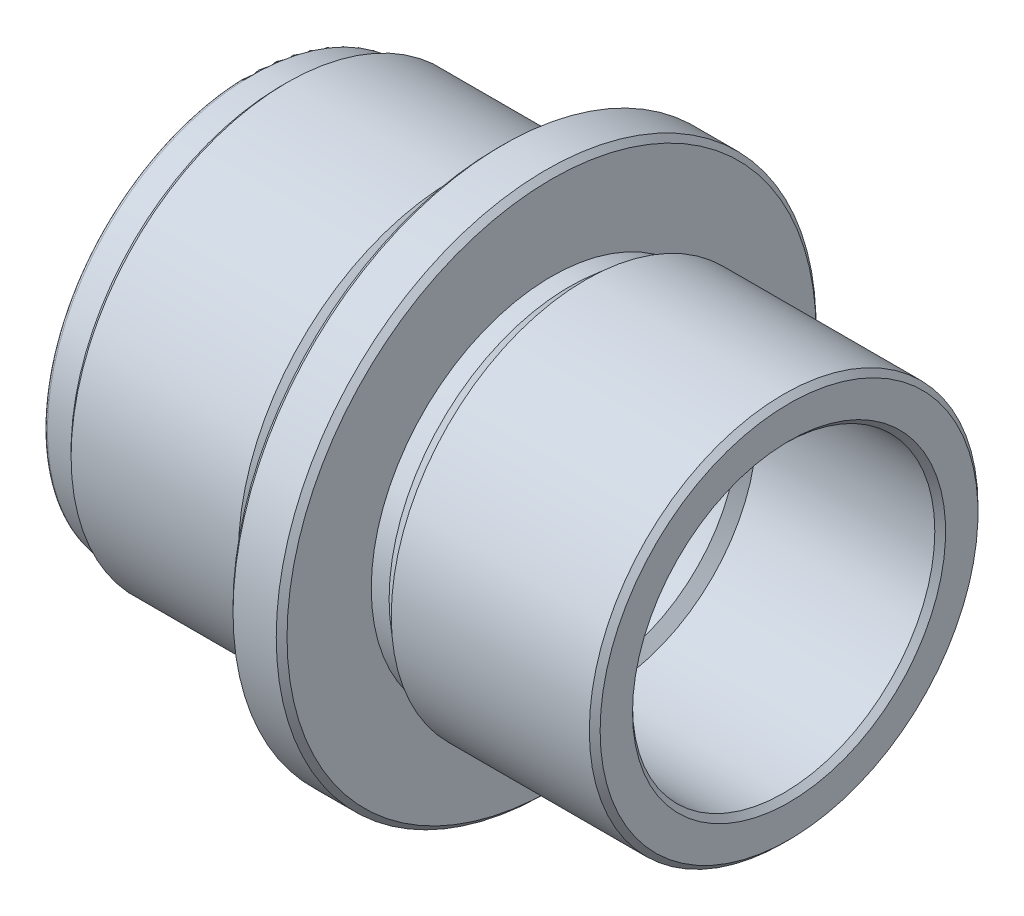
ISO-10303-21;
HEADER;
FILE_DESCRIPTION(('STEP AP214'),'2;1');
FILE_NAME('part.step','',(''),(''),'','','');
FILE_SCHEMA(('AUTOMOTIVE_DESIGN { 1 0 10303 214 1 1 1 1 }'));
ENDSEC;
DATA;
#1=APPLICATION_CONTEXT('core data for automotive mechanical design processes');
#2=APPLICATION_PROTOCOL_DEFINITION('international standard','automotive_design',2000,#1);
#3=PRODUCT_CONTEXT('',#1,'mechanical');
#4=PRODUCT('Part','Part','',(#3));
#5=PRODUCT_RELATED_PRODUCT_CATEGORY('part','',(#4));
#6=PRODUCT_DEFINITION_FORMATION('','',#4);
#7=PRODUCT_DEFINITION_CONTEXT('part definition',#1,'design');
#8=PRODUCT_DEFINITION('design','',#6,#7);
#9=PRODUCT_DEFINITION_SHAPE('','',#8);
#10=(LENGTH_UNIT() NAMED_UNIT(*) SI_UNIT(.MILLI.,.METRE.));
#11=(NAMED_UNIT(*) PLANE_ANGLE_UNIT() SI_UNIT($,.RADIAN.));
#12=(NAMED_UNIT(*) SI_UNIT($,.STERADIAN.) SOLID_ANGLE_UNIT());
#13=UNCERTAINTY_MEASURE_WITH_UNIT(LENGTH_MEASURE(1.E-05),#10,'distance_accuracy_value','');
#14=(GEOMETRIC_REPRESENTATION_CONTEXT(3) GLOBAL_UNCERTAINTY_ASSIGNED_CONTEXT((#13)) GLOBAL_UNIT_ASSIGNED_CONTEXT((#10,
#11,#12)) REPRESENTATION_CONTEXT('',''));
#15=CARTESIAN_POINT('',(0.,0.,0.));
#16=DIRECTION('',(0.,0.,1.));
#17=DIRECTION('',(1.,0.,0.));
#18=AXIS2_PLACEMENT_3D('',#15,#16,#17);
#19=CARTESIAN_POINT('',(0.,0.,0.));
#20=DIRECTION('',(-1.,0.,0.));
#21=DIRECTION('',(0.,0.,1.));
#22=AXIS2_PLACEMENT_3D('',#19,#20,#21);
#23=CYLINDRICAL_SURFACE('',#22,35.5600000000001);
#24=CARTESIAN_POINT('',(1.27000000000002,0.,0.));
#25=DIRECTION('',(1.,0.,0.));
#26=DIRECTION('',(0.,0.,-1.));
#27=AXIS2_PLACEMENT_3D('',#24,#25,#26);
#28=CIRCLE('',#27,35.5600000000001);
#29=CARTESIAN_POINT('',(1.27000000000002,0.,-35.5600000000001));
#30=VERTEX_POINT('',#29);
#31=EDGE_CURVE('E56',#30,#30,#28,.F.);
#32=ORIENTED_EDGE('',*,*,#31,.T.);
#33=EDGE_LOOP('',(#32));
#34=FACE_BOUND('',#33,.T.);
#35=CARTESIAN_POINT('',(10.16,0.,0.));
#36=DIRECTION('',(-1.,0.,0.));
#37=DIRECTION('',(0.,0.,1.));
#38=AXIS2_PLACEMENT_3D('',#35,#36,#37);
#39=CIRCLE('',#38,35.5600000000001);
#40=CARTESIAN_POINT('',(10.16,0.,35.5600000000001));
#41=VERTEX_POINT('',#40);
#42=EDGE_CURVE('E128',#41,#41,#39,.T.);
#43=ORIENTED_EDGE('',*,*,#42,.F.);
#44=EDGE_LOOP('',(#43));
#45=FACE_BOUND('',#44,.T.);
#46=ADVANCED_FACE('F34',(#34,#45),#23,.F.);
#47=CARTESIAN_POINT('',(0.,35.5600000000001,0.));
#48=DIRECTION('',(1.,0.,0.));
#49=DIRECTION('',(0.,0.,-1.));
#50=AXIS2_PLACEMENT_3D('',#47,#48,#49);
#51=PLANE('',#50);
#52=CARTESIAN_POINT('',(0.,0.,0.));
#53=DIRECTION('',(1.,0.,0.));
#54=DIRECTION('',(0.,0.,-1.));
#55=AXIS2_PLACEMENT_3D('',#52,#53,#54);
#56=CIRCLE('',#55,47.498);
#57=CARTESIAN_POINT('',(0.,0.,-47.498));
#58=VERTEX_POINT('',#57);
#59=EDGE_CURVE('E40',#58,#58,#56,.F.);
#60=ORIENTED_EDGE('',*,*,#59,.T.);
#61=EDGE_LOOP('',(#60));
#62=FACE_BOUND('',#61,.T.);
#63=CARTESIAN_POINT('',(0.,0.,0.));
#64=DIRECTION('',(1.,0.,0.));
#65=DIRECTION('',(0.,0.,-1.));
#66=AXIS2_PLACEMENT_3D('',#63,#64,#65);
#67=CIRCLE('',#66,36.8300000000001);
#68=CARTESIAN_POINT('',(0.,0.,-36.8300000000001));
#69=VERTEX_POINT('',#68);
#70=EDGE_CURVE('E53',#69,#69,#67,.T.);
#71=ORIENTED_EDGE('',*,*,#70,.T.);
#72=EDGE_LOOP('',(#71));
#73=FACE_BOUND('',#72,.T.);
#74=ADVANCED_FACE('F135',(#62,#73),#51,.F.);
#75=CARTESIAN_POINT('',(0.,0.,0.));
#76=DIRECTION('',(-1.,0.,0.));
#77=DIRECTION('',(0.,0.,1.));
#78=AXIS2_PLACEMENT_3D('',#75,#76,#77);
#79=CYLINDRICAL_SURFACE('',#78,48.26);
#80=CARTESIAN_POINT('',(0.762,0.,0.));
#81=DIRECTION('',(1.,0.,0.));
#82=DIRECTION('',(0.,0.,-1.));
#83=AXIS2_PLACEMENT_3D('',#80,#81,#82);
#84=CIRCLE('',#83,48.26);
#85=CARTESIAN_POINT('',(0.762,0.,-48.26));
#86=VERTEX_POINT('',#85);
#87=EDGE_CURVE('E10',#86,#86,#84,.T.);
#88=ORIENTED_EDGE('',*,*,#87,.T.);
#89=EDGE_LOOP('',(#88));
#90=FACE_BOUND('',#89,.T.);
#91=CARTESIAN_POINT('',(7.62,0.,0.));
#92=DIRECTION('',(-1.,0.,0.));
#93=DIRECTION('',(0.,0.,1.));
#94=AXIS2_PLACEMENT_3D('',#91,#92,#93);
#95=CIRCLE('',#94,48.26);
#96=CARTESIAN_POINT('',(7.62,0.,48.26));
#97=VERTEX_POINT('',#96);
#98=EDGE_CURVE('E89',#97,#97,#95,.T.);
#99=ORIENTED_EDGE('',*,*,#98,.T.);
#100=EDGE_LOOP('',(#99));
#101=FACE_BOUND('',#100,.T.);
#102=ADVANCED_FACE('F140',(#90,#101),#79,.T.);
#103=CARTESIAN_POINT('',(7.62,48.26,0.));
#104=DIRECTION('',(1.,0.,0.));
#105=DIRECTION('',(0.,0.,-1.));
#106=AXIS2_PLACEMENT_3D('',#103,#104,#105);
#107=PLANE('',#106);
#108=CARTESIAN_POINT('',(7.62,0.,0.));
#109=DIRECTION('',(1.,0.,0.));
#110=DIRECTION('',(0.,0.,-1.));
#111=AXIS2_PLACEMENT_3D('',#108,#109,#110);
#112=CIRCLE('',#111,49.53);
#113=CARTESIAN_POINT('',(7.62,0.,-49.53));
#114=VERTEX_POINT('',#113);
#115=EDGE_CURVE('E86',#114,#114,#112,.F.);
#116=ORIENTED_EDGE('',*,*,#115,.T.);
#117=EDGE_LOOP('',(#116));
#118=FACE_BOUND('',#117,.T.);
#119=ORIENTED_EDGE('',*,*,#98,.F.);
#120=EDGE_LOOP('',(#119));
#121=FACE_BOUND('',#120,.T.);
#122=ADVANCED_FACE('F247',(#118,#121),#107,.F.);
#123=CARTESIAN_POINT('',(0.,0.,0.));
#124=DIRECTION('',(-1.,0.,0.));
#125=DIRECTION('',(0.,0.,1.));
#126=AXIS2_PLACEMENT_3D('',#123,#124,#125);
#127=CYLINDRICAL_SURFACE('',#126,50.8);
#128=CARTESIAN_POINT('',(8.89000000000001,0.,0.));
#129=DIRECTION('',(1.,0.,0.));
#130=DIRECTION('',(0.,0.,-1.));
#131=AXIS2_PLACEMENT_3D('',#128,#129,#130);
#132=CIRCLE('',#131,50.8);
#133=CARTESIAN_POINT('',(8.89000000000001,0.,-50.8));
#134=VERTEX_POINT('',#133);
#135=EDGE_CURVE('E83',#134,#134,#132,.T.);
#136=ORIENTED_EDGE('',*,*,#135,.T.);
#137=EDGE_LOOP('',(#136));
#138=FACE_BOUND('',#137,.T.);
#139=CARTESIAN_POINT('',(48.26,0.,0.));
#140=DIRECTION('',(-1.,0.,0.));
#141=DIRECTION('',(0.,0.,1.));
#142=AXIS2_PLACEMENT_3D('',#139,#140,#141);
#143=CIRCLE('',#142,50.8);
#144=CARTESIAN_POINT('',(48.26,0.,50.8));
#145=VERTEX_POINT('',#144);
#146=EDGE_CURVE('E92',#145,#145,#143,.T.);
#147=ORIENTED_EDGE('',*,*,#146,.T.);
#148=EDGE_LOOP('',(#147));
#149=FACE_BOUND('',#148,.T.);
#150=ADVANCED_FACE('F243',(#138,#149),#127,.T.);
#151=CARTESIAN_POINT('',(50.8,0.,0.));
#152=DIRECTION('',(-1.,0.,0.));
#153=DIRECTION('',(0.,0.,1.));
#154=AXIS2_PLACEMENT_3D('',#151,#152,#153);
#155=CONICAL_SURFACE('',#154,48.26,0.785398163397448);
#156=ORIENTED_EDGE('',*,*,#146,.F.);
#157=EDGE_LOOP('',(#156));
#158=FACE_BOUND('',#157,.T.);
#159=CARTESIAN_POINT('',(50.8,0.,0.));
#160=DIRECTION('',(-1.,0.,0.));
#161=DIRECTION('',(0.,0.,1.));
#162=AXIS2_PLACEMENT_3D('',#159,#160,#161);
#163=CIRCLE('',#162,48.26);
#164=CARTESIAN_POINT('',(50.8,0.,48.26));
#165=VERTEX_POINT('',#164);
#166=EDGE_CURVE('E95',#165,#165,#163,.T.);
#167=ORIENTED_EDGE('',*,*,#166,.T.);
#168=EDGE_LOOP('',(#167));
#169=FACE_BOUND('',#168,.T.);
#170=ADVANCED_FACE('F239',(#158,#169),#155,.T.);
#171=CARTESIAN_POINT('',(0.,0.,0.));
#172=DIRECTION('',(-1.,0.,0.));
#173=DIRECTION('',(0.,0.,1.));
#174=AXIS2_PLACEMENT_3D('',#171,#172,#173);
#175=CYLINDRICAL_SURFACE('',#174,48.26);
#176=ORIENTED_EDGE('',*,*,#166,.F.);
#177=EDGE_LOOP('',(#176));
#178=FACE_BOUND('',#177,.T.);
#179=CARTESIAN_POINT('',(58.42,0.,0.));
#180=DIRECTION('',(-1.,0.,0.));
#181=DIRECTION('',(0.,0.,1.));
#182=AXIS2_PLACEMENT_3D('',#179,#180,#181);
#183=CIRCLE('',#182,48.26);
#184=CARTESIAN_POINT('',(58.42,0.,48.26));
#185=VERTEX_POINT('',#184);
#186=EDGE_CURVE('E98',#185,#185,#183,.T.);
#187=ORIENTED_EDGE('',*,*,#186,.T.);
#188=EDGE_LOOP('',(#187));
#189=FACE_BOUND('',#188,.T.);
#190=ADVANCED_FACE('F235',(#178,#189),#175,.T.);
#191=CARTESIAN_POINT('',(58.42,48.26,0.));
#192=DIRECTION('',(1.,0.,0.));
#193=DIRECTION('',(0.,0.,-1.));
#194=AXIS2_PLACEMENT_3D('',#191,#192,#193);
#195=PLANE('',#194);
#196=CARTESIAN_POINT('',(58.42,0.,0.));
#197=DIRECTION('',(1.,0.,0.));
#198=DIRECTION('',(0.,0.,-1.));
#199=AXIS2_PLACEMENT_3D('',#196,#197,#198);
#200=CIRCLE('',#199,62.23);
#201=CARTESIAN_POINT('',(58.42,0.,-62.23));
#202=VERTEX_POINT('',#201);
#203=EDGE_CURVE('E80',#202,#202,#200,.F.);
#204=ORIENTED_EDGE('',*,*,#203,.T.);
#205=EDGE_LOOP('',(#204));
#206=FACE_BOUND('',#205,.T.);
#207=ORIENTED_EDGE('',*,*,#186,.F.);
#208=EDGE_LOOP('',(#207));
#209=FACE_BOUND('',#208,.T.);
#210=ADVANCED_FACE('F231',(#206,#209),#195,.F.);
#211=CARTESIAN_POINT('',(0.,0.,0.));
#212=DIRECTION('',(-1.,0.,0.));
#213=DIRECTION('',(0.,0.,1.));
#214=AXIS2_PLACEMENT_3D('',#211,#212,#213);
#215=CYLINDRICAL_SURFACE('',#214,63.5);
#216=CARTESIAN_POINT('',(59.69,0.,0.));
#217=DIRECTION('',(1.,0.,0.));
#218=DIRECTION('',(0.,0.,-1.));
#219=AXIS2_PLACEMENT_3D('',#216,#217,#218);
#220=CIRCLE('',#219,63.5);
#221=CARTESIAN_POINT('',(59.69,0.,-63.5));
#222=VERTEX_POINT('',#221);
#223=EDGE_CURVE('E74',#222,#222,#220,.T.);
#224=ORIENTED_EDGE('',*,*,#223,.T.);
#225=EDGE_LOOP('',(#224));
#226=FACE_BOUND('',#225,.T.);
#227=CARTESIAN_POINT('',(69.8499999999998,0.,0.));
#228=DIRECTION('',(-1.,0.,0.));
#229=DIRECTION('',(0.,0.,1.));
#230=AXIS2_PLACEMENT_3D('',#227,#228,#229);
#231=CIRCLE('',#230,63.5);
#232=CARTESIAN_POINT('',(69.8499999999998,0.,63.5));
#233=VERTEX_POINT('',#232);
#234=EDGE_CURVE('E77',#233,#233,#231,.T.);
#235=ORIENTED_EDGE('',*,*,#234,.T.);
#236=EDGE_LOOP('',(#235));
#237=FACE_BOUND('',#236,.T.);
#238=ADVANCED_FACE('F227',(#226,#237),#215,.T.);
#239=CARTESIAN_POINT('',(71.1199999999999,63.5,0.));
#240=DIRECTION('',(-1.,0.,0.));
#241=DIRECTION('',(0.,0.,1.));
#242=AXIS2_PLACEMENT_3D('',#239,#240,#241);
#243=PLANE('',#242);
#244=CARTESIAN_POINT('',(71.1199999999999,0.,0.));
#245=DIRECTION('',(-1.,0.,0.));
#246=DIRECTION('',(0.,0.,1.));
#247=AXIS2_PLACEMENT_3D('',#244,#245,#246);
#248=CIRCLE('',#247,62.23);
#249=CARTESIAN_POINT('',(71.1199999999999,0.,62.23));
#250=VERTEX_POINT('',#249);
#251=EDGE_CURVE('E71',#250,#250,#248,.F.);
#252=ORIENTED_EDGE('',*,*,#251,.T.);
#253=EDGE_LOOP('',(#252));
#254=FACE_BOUND('',#253,.T.);
#255=CARTESIAN_POINT('',(71.1199999999999,0.,0.));
#256=DIRECTION('',(-1.,0.,0.));
#257=DIRECTION('',(0.,0.,1.));
#258=AXIS2_PLACEMENT_3D('',#255,#256,#257);
#259=CIRCLE('',#258,42.4161080074488);
#260=CARTESIAN_POINT('',(71.1199999999999,0.,42.4161080074488));
#261=VERTEX_POINT('',#260);
#262=EDGE_CURVE('E101',#261,#261,#259,.T.);
#263=ORIENTED_EDGE('',*,*,#262,.T.);
#264=EDGE_LOOP('',(#263));
#265=FACE_BOUND('',#264,.T.);
#266=ADVANCED_FACE('F223',(#254,#265),#243,.F.);
#267=CARTESIAN_POINT('',(0.,0.,0.));
#268=DIRECTION('',(-1.,0.,0.));
#269=DIRECTION('',(0.,0.,1.));
#270=AXIS2_PLACEMENT_3D('',#267,#268,#269);
#271=CYLINDRICAL_SURFACE('',#270,42.4161080074488);
#272=ORIENTED_EDGE('',*,*,#262,.F.);
#273=EDGE_LOOP('',(#272));
#274=FACE_BOUND('',#273,.T.);
#275=CARTESIAN_POINT('',(75.319090909091,0.,0.));
#276=DIRECTION('',(-1.,0.,0.));
#277=DIRECTION('',(0.,0.,1.));
#278=AXIS2_PLACEMENT_3D('',#275,#276,#277);
#279=CIRCLE('',#278,42.4161080074488);
#280=CARTESIAN_POINT('',(75.319090909091,0.,42.4161080074488));
#281=VERTEX_POINT('',#280);
#282=EDGE_CURVE('E104',#281,#281,#279,.T.);
#283=ORIENTED_EDGE('',*,*,#282,.T.);
#284=EDGE_LOOP('',(#283));
#285=FACE_BOUND('',#284,.T.);
#286=ADVANCED_FACE('F219',(#274,#285),#271,.T.);
#287=CARTESIAN_POINT('',(79.1290909090907,0.,0.));
#288=DIRECTION('',(1.,0.,0.));
#289=DIRECTION('',(0.,0.,-1.));
#290=AXIS2_PLACEMENT_3D('',#287,#288,#289);
#291=CONICAL_SURFACE('',#290,45.72,0.714374212284132);
#292=ORIENTED_EDGE('',*,*,#282,.F.);
#293=EDGE_LOOP('',(#292));
#294=FACE_BOUND('',#293,.T.);
#295=CARTESIAN_POINT('',(79.1290909090907,0.,0.));
#296=DIRECTION('',(-1.,0.,0.));
#297=DIRECTION('',(0.,0.,1.));
#298=AXIS2_PLACEMENT_3D('',#295,#296,#297);
#299=CIRCLE('',#298,45.72);
#300=CARTESIAN_POINT('',(79.1290909090907,0.,45.72));
#301=VERTEX_POINT('',#300);
#302=EDGE_CURVE('E107',#301,#301,#299,.T.);
#303=ORIENTED_EDGE('',*,*,#302,.T.);
#304=EDGE_LOOP('',(#303));
#305=FACE_BOUND('',#304,.T.);
#306=ADVANCED_FACE('F215',(#294,#305),#291,.T.);
#307=CARTESIAN_POINT('',(0.,0.,0.));
#308=DIRECTION('',(-1.,0.,0.));
#309=DIRECTION('',(0.,0.,1.));
#310=AXIS2_PLACEMENT_3D('',#307,#308,#309);
#311=CYLINDRICAL_SURFACE('',#310,45.72);
#312=CARTESIAN_POINT('',(125.73,0.,0.));
#313=DIRECTION('',(-1.,0.,0.));
#314=DIRECTION('',(0.,0.,1.));
#315=AXIS2_PLACEMENT_3D('',#312,#313,#314);
#316=CIRCLE('',#315,45.72);
#317=CARTESIAN_POINT('',(125.73,0.,45.72));
#318=VERTEX_POINT('',#317);
#319=EDGE_CURVE('E68',#318,#318,#316,.T.);
#320=ORIENTED_EDGE('',*,*,#319,.T.);
#321=EDGE_LOOP('',(#320));
#322=FACE_BOUND('',#321,.T.);
#323=ORIENTED_EDGE('',*,*,#302,.F.);
#324=EDGE_LOOP('',(#323));
#325=FACE_BOUND('',#324,.T.);
#326=ADVANCED_FACE('F211',(#322,#325),#311,.T.);
#327=CARTESIAN_POINT('',(127.,45.72,0.));
#328=DIRECTION('',(-1.,0.,0.));
#329=DIRECTION('',(0.,0.,1.));
#330=AXIS2_PLACEMENT_3D('',#327,#328,#329);
#331=PLANE('',#330);
#332=CARTESIAN_POINT('',(127.,0.,0.));
#333=DIRECTION('',(-1.,0.,0.));
#334=DIRECTION('',(0.,0.,1.));
#335=AXIS2_PLACEMENT_3D('',#332,#333,#334);
#336=CIRCLE('',#335,44.45);
#337=CARTESIAN_POINT('',(127.,0.,44.45));
#338=VERTEX_POINT('',#337);
#339=EDGE_CURVE('E62',#338,#338,#336,.F.);
#340=ORIENTED_EDGE('',*,*,#339,.T.);
#341=EDGE_LOOP('',(#340));
#342=FACE_BOUND('',#341,.T.);
#343=CARTESIAN_POINT('',(127.,0.,0.));
#344=DIRECTION('',(-1.,0.,0.));
#345=DIRECTION('',(0.,0.,1.));
#346=AXIS2_PLACEMENT_3D('',#343,#344,#345);
#347=CIRCLE('',#346,36.8300000000001);
#348=CARTESIAN_POINT('',(127.,0.,36.8300000000001));
#349=VERTEX_POINT('',#348);
#350=EDGE_CURVE('E65',#349,#349,#347,.T.);
#351=ORIENTED_EDGE('',*,*,#350,.T.);
#352=EDGE_LOOP('',(#351));
#353=FACE_BOUND('',#352,.T.);
#354=ADVANCED_FACE('F207',(#342,#353),#331,.F.);
#355=CARTESIAN_POINT('',(0.,0.,0.));
#356=DIRECTION('',(-1.,0.,0.));
#357=DIRECTION('',(0.,0.,1.));
#358=AXIS2_PLACEMENT_3D('',#355,#356,#357);
#359=CYLINDRICAL_SURFACE('',#358,35.5600000000001);
#360=CARTESIAN_POINT('',(125.73,0.,0.));
#361=DIRECTION('',(-1.,0.,0.));
#362=DIRECTION('',(0.,0.,1.));
#363=AXIS2_PLACEMENT_3D('',#360,#361,#362);
#364=CIRCLE('',#363,35.5600000000001);
#365=CARTESIAN_POINT('',(125.73,0.,35.5600000000001));
#366=VERTEX_POINT('',#365);
#367=EDGE_CURVE('E59',#366,#366,#364,.F.);
#368=ORIENTED_EDGE('',*,*,#367,.T.);
#369=EDGE_LOOP('',(#368));
#370=FACE_BOUND('',#369,.T.);
#371=CARTESIAN_POINT('',(83.8200000000001,0.,0.));
#372=DIRECTION('',(-1.,0.,0.));
#373=DIRECTION('',(0.,0.,1.));
#374=AXIS2_PLACEMENT_3D('',#371,#372,#373);
#375=CIRCLE('',#374,35.5600000000001);
#376=CARTESIAN_POINT('',(83.8200000000001,0.,35.5600000000001));
#377=VERTEX_POINT('',#376);
#378=EDGE_CURVE('E110',#377,#377,#375,.T.);
#379=ORIENTED_EDGE('',*,*,#378,.T.);
#380=EDGE_LOOP('',(#379));
#381=FACE_BOUND('',#380,.T.);
#382=ADVANCED_FACE('F203',(#370,#381),#359,.F.);
#383=CARTESIAN_POINT('',(81.915,0.,0.));
#384=DIRECTION('',(1.,0.,0.));
#385=DIRECTION('',(0.,0.,-1.));
#386=AXIS2_PLACEMENT_3D('',#383,#384,#385);
#387=CONICAL_SURFACE('',#386,33.0200000000001,0.927295218001588);
#388=ORIENTED_EDGE('',*,*,#378,.F.);
#389=EDGE_LOOP('',(#388));
#390=FACE_BOUND('',#389,.T.);
#391=CARTESIAN_POINT('',(81.915,0.,0.));
#392=DIRECTION('',(-1.,0.,0.));
#393=DIRECTION('',(0.,0.,1.));
#394=AXIS2_PLACEMENT_3D('',#391,#392,#393);
#395=CIRCLE('',#394,33.0200000000001);
#396=CARTESIAN_POINT('',(81.915,0.,33.0200000000001));
#397=VERTEX_POINT('',#396);
#398=EDGE_CURVE('E113',#397,#397,#395,.T.);
#399=ORIENTED_EDGE('',*,*,#398,.T.);
#400=EDGE_LOOP('',(#399));
#401=FACE_BOUND('',#400,.T.);
#402=ADVANCED_FACE('F199',(#390,#401),#387,.F.);
#403=CARTESIAN_POINT('',(0.,0.,0.));
#404=DIRECTION('',(-1.,0.,0.));
#405=DIRECTION('',(0.,0.,1.));
#406=AXIS2_PLACEMENT_3D('',#403,#404,#405);
#407=CYLINDRICAL_SURFACE('',#406,33.0200000000001);
#408=ORIENTED_EDGE('',*,*,#398,.F.);
#409=EDGE_LOOP('',(#408));
#410=FACE_BOUND('',#409,.T.);
#411=CARTESIAN_POINT('',(63.5,0.,0.));
#412=DIRECTION('',(-1.,0.,0.));
#413=DIRECTION('',(0.,0.,1.));
#414=AXIS2_PLACEMENT_3D('',#411,#412,#413);
#415=CIRCLE('',#414,33.0200000000001);
#416=CARTESIAN_POINT('',(63.5,0.,33.0200000000001));
#417=VERTEX_POINT('',#416);
#418=EDGE_CURVE('E116',#417,#417,#415,.T.);
#419=ORIENTED_EDGE('',*,*,#418,.T.);
#420=EDGE_LOOP('',(#419));
#421=FACE_BOUND('',#420,.T.);
#422=ADVANCED_FACE('F195',(#410,#421),#407,.F.);
#423=CARTESIAN_POINT('',(63.5,33.0200000000001,0.));
#424=DIRECTION('',(-1.,0.,0.));
#425=DIRECTION('',(0.,0.,1.));
#426=AXIS2_PLACEMENT_3D('',#423,#424,#425);
#427=PLANE('',#426);
#428=ORIENTED_EDGE('',*,*,#418,.F.);
#429=EDGE_LOOP('',(#428));
#430=FACE_BOUND('',#429,.T.);
#431=CARTESIAN_POINT('',(63.5,0.,0.));
#432=DIRECTION('',(-1.,0.,0.));
#433=DIRECTION('',(0.,0.,1.));
#434=AXIS2_PLACEMENT_3D('',#431,#432,#433);
#435=CIRCLE('',#434,30.4800000000001);
#436=CARTESIAN_POINT('',(63.5,0.,30.4800000000001));
#437=VERTEX_POINT('',#436);
#438=EDGE_CURVE('E119',#437,#437,#435,.T.);
#439=ORIENTED_EDGE('',*,*,#438,.T.);
#440=EDGE_LOOP('',(#439));
#441=FACE_BOUND('',#440,.T.);
#442=ADVANCED_FACE('F191',(#430,#441),#427,.F.);
#443=CARTESIAN_POINT('',(0.,0.,0.));
#444=DIRECTION('',(-1.,0.,0.));
#445=DIRECTION('',(0.,0.,1.));
#446=AXIS2_PLACEMENT_3D('',#443,#444,#445);
#447=CYLINDRICAL_SURFACE('',#446,30.4800000000001);
#448=CARTESIAN_POINT('',(39.37,0.,0.));
#449=DIRECTION('',(1.,0.,0.));
#450=DIRECTION('',(0.,0.,-1.));
#451=AXIS2_PLACEMENT_3D('',#448,#449,#450);
#452=CIRCLE('',#451,30.4800000000001);
#453=CARTESIAN_POINT('',(39.37,0.,-30.4800000000001));
#454=VERTEX_POINT('',#453);
#455=EDGE_CURVE('E48',#454,#454,#452,.F.);
#456=ORIENTED_EDGE('',*,*,#455,.T.);
#457=EDGE_LOOP('',(#456));
#458=FACE_BOUND('',#457,.T.);
#459=ORIENTED_EDGE('',*,*,#438,.F.);
#460=EDGE_LOOP('',(#459));
#461=FACE_BOUND('',#460,.T.);
#462=ADVANCED_FACE('F187',(#458,#461),#447,.F.);
#463=CARTESIAN_POINT('',(38.1,30.4800000000001,0.));
#464=DIRECTION('',(1.,0.,0.));
#465=DIRECTION('',(0.,0.,-1.));
#466=AXIS2_PLACEMENT_3D('',#463,#464,#465);
#467=PLANE('',#466);
#468=CARTESIAN_POINT('',(38.1,0.,0.));
#469=DIRECTION('',(1.,0.,0.));
#470=DIRECTION('',(0.,0.,-1.));
#471=AXIS2_PLACEMENT_3D('',#468,#469,#470);
#472=CIRCLE('',#471,31.7500000000001);
#473=CARTESIAN_POINT('',(38.1,0.,-31.7500000000001));
#474=VERTEX_POINT('',#473);
#475=EDGE_CURVE('E44',#474,#474,#472,.T.);
#476=ORIENTED_EDGE('',*,*,#475,.T.);
#477=EDGE_LOOP('',(#476));
#478=FACE_BOUND('',#477,.T.);
#479=CARTESIAN_POINT('',(38.1,0.,0.));
#480=DIRECTION('',(-1.,0.,0.));
#481=DIRECTION('',(0.,0.,1.));
#482=AXIS2_PLACEMENT_3D('',#479,#480,#481);
#483=CIRCLE('',#482,38.1000000000001);
#484=CARTESIAN_POINT('',(38.1,0.,38.1000000000001));
#485=VERTEX_POINT('',#484);
#486=EDGE_CURVE('E122',#485,#485,#483,.T.);
#487=ORIENTED_EDGE('',*,*,#486,.T.);
#488=EDGE_LOOP('',(#487));
#489=FACE_BOUND('',#488,.T.);
#490=ADVANCED_FACE('F183',(#478,#489),#467,.F.);
#491=CARTESIAN_POINT('',(0.,0.,0.));
#492=DIRECTION('',(-1.,0.,0.));
#493=DIRECTION('',(0.,0.,1.));
#494=AXIS2_PLACEMENT_3D('',#491,#492,#493);
#495=CYLINDRICAL_SURFACE('',#494,38.1000000000001);
#496=ORIENTED_EDGE('',*,*,#486,.F.);
#497=EDGE_LOOP('',(#496));
#498=FACE_BOUND('',#497,.T.);
#499=CARTESIAN_POINT('',(10.16,0.,0.));
#500=DIRECTION('',(-1.,0.,0.));
#501=DIRECTION('',(0.,0.,1.));
#502=AXIS2_PLACEMENT_3D('',#499,#500,#501);
#503=CIRCLE('',#502,38.1000000000001);
#504=CARTESIAN_POINT('',(10.16,0.,38.1000000000001));
#505=VERTEX_POINT('',#504);
#506=EDGE_CURVE('E125',#505,#505,#503,.T.);
#507=ORIENTED_EDGE('',*,*,#506,.T.);
#508=EDGE_LOOP('',(#507));
#509=FACE_BOUND('',#508,.T.);
#510=ADVANCED_FACE('F179',(#498,#509),#495,.F.);
#511=CARTESIAN_POINT('',(10.16,38.1000000000001,0.));
#512=DIRECTION('',(-1.,0.,0.));
#513=DIRECTION('',(0.,0.,1.));
#514=AXIS2_PLACEMENT_3D('',#511,#512,#513);
#515=PLANE('',#514);
#516=ORIENTED_EDGE('',*,*,#506,.F.);
#517=EDGE_LOOP('',(#516));
#518=FACE_BOUND('',#517,.T.);
#519=ORIENTED_EDGE('',*,*,#42,.T.);
#520=EDGE_LOOP('',(#519));
#521=FACE_BOUND('',#520,.T.);
#522=ADVANCED_FACE('F132',(#518,#521),#515,.F.);
#523=CARTESIAN_POINT('',(7.62,0.,0.));
#524=DIRECTION('',(1.,0.,0.));
#525=DIRECTION('',(0.,0.,-1.));
#526=AXIS2_PLACEMENT_3D('',#523,#524,#525);
#527=CONICAL_SURFACE('',#526,49.53,0.785398163397453);
#528=ORIENTED_EDGE('',*,*,#135,.F.);
#529=EDGE_LOOP('',(#528));
#530=FACE_BOUND('',#529,.T.);
#531=ORIENTED_EDGE('',*,*,#115,.F.);
#532=EDGE_LOOP('',(#531));
#533=FACE_BOUND('',#532,.T.);
#534=ADVANCED_FACE('F172',(#530,#533),#527,.T.);
#535=CARTESIAN_POINT('',(58.42,0.,0.));
#536=DIRECTION('',(1.,0.,0.));
#537=DIRECTION('',(0.,0.,-1.));
#538=AXIS2_PLACEMENT_3D('',#535,#536,#537);
#539=CONICAL_SURFACE('',#538,62.23,0.785398163397454);
#540=ORIENTED_EDGE('',*,*,#223,.F.);
#541=EDGE_LOOP('',(#540));
#542=FACE_BOUND('',#541,.T.);
#543=ORIENTED_EDGE('',*,*,#203,.F.);
#544=EDGE_LOOP('',(#543));
#545=FACE_BOUND('',#544,.T.);
#546=ADVANCED_FACE('F168',(#542,#545),#539,.T.);
#547=CARTESIAN_POINT('',(69.8499999999998,0.,0.));
#548=DIRECTION('',(-1.,0.,0.));
#549=DIRECTION('',(0.,0.,1.));
#550=AXIS2_PLACEMENT_3D('',#547,#548,#549);
#551=CONICAL_SURFACE('',#550,63.5,0.785398163397443);
#552=ORIENTED_EDGE('',*,*,#251,.F.);
#553=EDGE_LOOP('',(#552));
#554=FACE_BOUND('',#553,.T.);
#555=ORIENTED_EDGE('',*,*,#234,.F.);
#556=EDGE_LOOP('',(#555));
#557=FACE_BOUND('',#556,.T.);
#558=ADVANCED_FACE('F164',(#554,#557),#551,.T.);
#559=CARTESIAN_POINT('',(125.73,0.,0.));
#560=DIRECTION('',(-1.,0.,0.));
#561=DIRECTION('',(0.,0.,1.));
#562=AXIS2_PLACEMENT_3D('',#559,#560,#561);
#563=CONICAL_SURFACE('',#562,45.72,0.785398163397443);
#564=ORIENTED_EDGE('',*,*,#339,.F.);
#565=EDGE_LOOP('',(#564));
#566=FACE_BOUND('',#565,.T.);
#567=ORIENTED_EDGE('',*,*,#319,.F.);
#568=EDGE_LOOP('',(#567));
#569=FACE_BOUND('',#568,.T.);
#570=ADVANCED_FACE('F156',(#566,#569),#563,.T.);
#571=CARTESIAN_POINT('',(127.,0.,0.));
#572=DIRECTION('',(1.,0.,0.));
#573=DIRECTION('',(0.,0.,-1.));
#574=AXIS2_PLACEMENT_3D('',#571,#572,#573);
#575=CONICAL_SURFACE('',#574,36.8300000000001,0.785398163397448);
#576=ORIENTED_EDGE('',*,*,#367,.F.);
#577=EDGE_LOOP('',(#576));
#578=FACE_BOUND('',#577,.T.);
#579=ORIENTED_EDGE('',*,*,#350,.F.);
#580=EDGE_LOOP('',(#579));
#581=FACE_BOUND('',#580,.T.);
#582=ADVANCED_FACE('F146',(#578,#581),#575,.F.);
#583=CARTESIAN_POINT('',(1.27000000000002,0.,0.));
#584=DIRECTION('',(-1.,0.,0.));
#585=DIRECTION('',(0.,0.,1.));
#586=AXIS2_PLACEMENT_3D('',#583,#584,#585);
#587=CONICAL_SURFACE('',#586,35.5600000000001,0.785398163397442);
#588=ORIENTED_EDGE('',*,*,#70,.F.);
#589=EDGE_LOOP('',(#588));
#590=FACE_BOUND('',#589,.T.);
#591=ORIENTED_EDGE('',*,*,#31,.F.);
#592=EDGE_LOOP('',(#591));
#593=FACE_BOUND('',#592,.T.);
#594=ADVANCED_FACE('F143',(#590,#593),#587,.F.);
#595=CARTESIAN_POINT('',(39.37,0.,0.));
#596=DIRECTION('',(-1.,0.,0.));
#597=DIRECTION('',(0.,0.,1.));
#598=AXIS2_PLACEMENT_3D('',#595,#596,#597);
#599=CONICAL_SURFACE('',#598,30.4800000000001,0.785398163397444);
#600=ORIENTED_EDGE('',*,*,#475,.F.);
#601=EDGE_LOOP('',(#600));
#602=FACE_BOUND('',#601,.T.);
#603=ORIENTED_EDGE('',*,*,#455,.F.);
#604=EDGE_LOOP('',(#603));
#605=FACE_BOUND('',#604,.T.);
#606=ADVANCED_FACE('F145',(#602,#605),#599,.F.);
#607=CARTESIAN_POINT('',(0.762,0.,0.));
#608=DIRECTION('',(1.,0.,0.));
#609=DIRECTION('',(0.,0.,-1.));
#610=AXIS2_PLACEMENT_3D('',#607,#608,#609);
#611=TOROIDAL_SURFACE('',#610,47.498,0.762);
#612=ORIENTED_EDGE('',*,*,#87,.F.);
#613=EDGE_LOOP('',(#612));
#614=FACE_BOUND('',#613,.T.);
#615=ORIENTED_EDGE('',*,*,#59,.F.);
#616=EDGE_LOOP('',(#615));
#617=FACE_BOUND('',#616,.T.);
#618=ADVANCED_FACE('F153',(#614,#617),#611,.T.);
#619=CLOSED_SHELL('',(#46,#74,#102,#122,#150,#170,#190,#210,#238,#266,#286,#306,#326,#354,#382,
#402,#422,#442,#462,#490,#510,#522,#534,#546,#558,#570,#582,#594,#606,#618));
#620=MANIFOLD_SOLID_BREP('B2',#619);
#621=ADVANCED_BREP_SHAPE_REPRESENTATION('',(#18,#620),#14);
#622=SHAPE_DEFINITION_REPRESENTATION(#9,#621);
ENDSEC;
END-ISO-10303-21;
